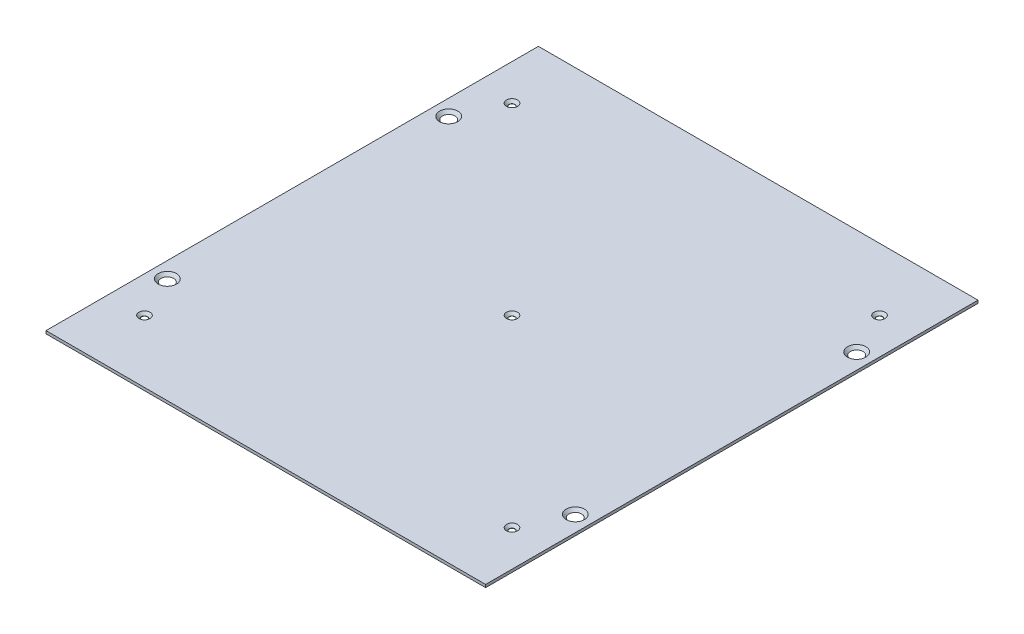
ISO-10303-21;
HEADER;
FILE_DESCRIPTION(('STEP AP214'),'2;1');
FILE_NAME('part.step','',(''),(''),'','','');
FILE_SCHEMA(('AUTOMOTIVE_DESIGN { 1 0 10303 214 1 1 1 1 }'));
ENDSEC;
DATA;
#1=APPLICATION_CONTEXT('core data for automotive mechanical design processes');
#2=APPLICATION_PROTOCOL_DEFINITION('international standard','automotive_design',2000,#1);
#3=PRODUCT_CONTEXT('',#1,'mechanical');
#4=PRODUCT('Part','Part','',(#3));
#5=PRODUCT_RELATED_PRODUCT_CATEGORY('part','',(#4));
#6=PRODUCT_DEFINITION_FORMATION('','',#4);
#7=PRODUCT_DEFINITION_CONTEXT('part definition',#1,'design');
#8=PRODUCT_DEFINITION('design','',#6,#7);
#9=PRODUCT_DEFINITION_SHAPE('','',#8);
#10=(LENGTH_UNIT() NAMED_UNIT(*) SI_UNIT(.MILLI.,.METRE.));
#11=(NAMED_UNIT(*) PLANE_ANGLE_UNIT() SI_UNIT($,.RADIAN.));
#12=(NAMED_UNIT(*) SI_UNIT($,.STERADIAN.) SOLID_ANGLE_UNIT());
#13=UNCERTAINTY_MEASURE_WITH_UNIT(LENGTH_MEASURE(1.E-05),#10,'distance_accuracy_value','');
#14=(GEOMETRIC_REPRESENTATION_CONTEXT(3) GLOBAL_UNCERTAINTY_ASSIGNED_CONTEXT((#13)) GLOBAL_UNIT_ASSIGNED_CONTEXT((#10,
#11,#12)) REPRESENTATION_CONTEXT('',''));
#15=CARTESIAN_POINT('',(0.,0.,0.));
#16=DIRECTION('',(0.,0.,1.));
#17=DIRECTION('',(1.,0.,0.));
#18=AXIS2_PLACEMENT_3D('',#15,#16,#17);
#19=CARTESIAN_POINT('',(125.,0.,140.));
#20=DIRECTION('',(0.,1.,0.));
#21=DIRECTION('',(0.,0.,1.));
#22=AXIS2_PLACEMENT_3D('',#19,#20,#21);
#23=PLANE('',#22);
#24=CARTESIAN_POINT('',(0.,0.,0.));
#25=DIRECTION('',(0.,1.,0.));
#26=DIRECTION('',(0.,0.,1.));
#27=AXIS2_PLACEMENT_3D('',#24,#25,#26);
#28=CIRCLE('',#27,1.7);
#29=CARTESIAN_POINT('',(0.,0.,1.7));
#30=VERTEX_POINT('',#29);
#31=EDGE_CURVE('E367',#30,#30,#28,.T.);
#32=ORIENTED_EDGE('',*,*,#31,.T.);
#33=EDGE_LOOP('',(#32));
#34=FACE_BOUND('',#33,.T.);
#35=CARTESIAN_POINT('',(-104.5,0.,104.5));
#36=DIRECTION('',(0.,1.,0.));
#37=DIRECTION('',(0.,0.,1.));
#38=AXIS2_PLACEMENT_3D('',#35,#36,#37);
#39=CIRCLE('',#38,1.69999999999999);
#40=CARTESIAN_POINT('',(-104.5,0.,106.2));
#41=VERTEX_POINT('',#40);
#42=EDGE_CURVE('E378',#41,#41,#39,.T.);
#43=ORIENTED_EDGE('',*,*,#42,.T.);
#44=EDGE_LOOP('',(#43));
#45=FACE_BOUND('',#44,.T.);
#46=CARTESIAN_POINT('',(104.5,0.,104.5));
#47=DIRECTION('',(0.,1.,0.));
#48=DIRECTION('',(0.,0.,1.));
#49=AXIS2_PLACEMENT_3D('',#46,#47,#48);
#50=CIRCLE('',#49,1.69999999999999);
#51=CARTESIAN_POINT('',(104.5,0.,106.2));
#52=VERTEX_POINT('',#51);
#53=EDGE_CURVE('E183',#52,#52,#50,.T.);
#54=ORIENTED_EDGE('',*,*,#53,.T.);
#55=EDGE_LOOP('',(#54));
#56=FACE_BOUND('',#55,.T.);
#57=CARTESIAN_POINT('',(104.5,0.,-104.5));
#58=DIRECTION('',(0.,1.,0.));
#59=DIRECTION('',(0.,0.,1.));
#60=AXIS2_PLACEMENT_3D('',#57,#58,#59);
#61=CIRCLE('',#60,1.69999999999999);
#62=CARTESIAN_POINT('',(104.5,0.,-102.8));
#63=VERTEX_POINT('',#62);
#64=EDGE_CURVE('E171',#63,#63,#61,.T.);
#65=ORIENTED_EDGE('',*,*,#64,.T.);
#66=EDGE_LOOP('',(#65));
#67=FACE_BOUND('',#66,.T.);
#68=CARTESIAN_POINT('',(-104.5,0.,-104.5));
#69=DIRECTION('',(0.,1.,0.));
#70=DIRECTION('',(0.,0.,1.));
#71=AXIS2_PLACEMENT_3D('',#68,#69,#70);
#72=CIRCLE('',#71,1.69999999999999);
#73=CARTESIAN_POINT('',(-104.5,0.,-102.8));
#74=VERTEX_POINT('',#73);
#75=EDGE_CURVE('E160',#74,#74,#72,.T.);
#76=ORIENTED_EDGE('',*,*,#75,.T.);
#77=EDGE_LOOP('',(#76));
#78=FACE_BOUND('',#77,.T.);
#79=CARTESIAN_POINT('',(-116.,0.,-80.));
#80=DIRECTION('',(0.,1.,0.));
#81=DIRECTION('',(0.,0.,1.));
#82=AXIS2_PLACEMENT_3D('',#79,#80,#81);
#83=CIRCLE('',#82,3.6);
#84=CARTESIAN_POINT('',(-116.,0.,-76.4));
#85=VERTEX_POINT('',#84);
#86=EDGE_CURVE('E153',#85,#85,#83,.T.);
#87=ORIENTED_EDGE('',*,*,#86,.T.);
#88=EDGE_LOOP('',(#87));
#89=FACE_BOUND('',#88,.T.);
#90=CARTESIAN_POINT('',(116.,0.,-80.));
#91=DIRECTION('',(0.,1.,0.));
#92=DIRECTION('',(0.,0.,1.));
#93=AXIS2_PLACEMENT_3D('',#90,#91,#92);
#94=CIRCLE('',#93,3.6);
#95=CARTESIAN_POINT('',(116.,0.,-76.3999999999999));
#96=VERTEX_POINT('',#95);
#97=EDGE_CURVE('E142',#96,#96,#94,.T.);
#98=ORIENTED_EDGE('',*,*,#97,.T.);
#99=EDGE_LOOP('',(#98));
#100=FACE_BOUND('',#99,.T.);
#101=CARTESIAN_POINT('',(116.,0.,80.));
#102=DIRECTION('',(0.,1.,0.));
#103=DIRECTION('',(0.,0.,1.));
#104=AXIS2_PLACEMENT_3D('',#101,#102,#103);
#105=CIRCLE('',#104,3.6);
#106=CARTESIAN_POINT('',(116.,0.,83.6));
#107=VERTEX_POINT('',#106);
#108=EDGE_CURVE('E134',#107,#107,#105,.T.);
#109=ORIENTED_EDGE('',*,*,#108,.T.);
#110=EDGE_LOOP('',(#109));
#111=FACE_BOUND('',#110,.T.);
#112=DIRECTION('',(0.,0.,-1.));
#113=VECTOR('',#112,1.);
#114=CARTESIAN_POINT('',(125.,0.,-140.));
#115=LINE('',#114,#113);
#116=CARTESIAN_POINT('',(125.,0.,140.));
#117=VERTEX_POINT('',#116);
#118=CARTESIAN_POINT('',(125.,0.,-140.));
#119=VERTEX_POINT('',#118);
#120=EDGE_CURVE('E103',#117,#119,#115,.T.);
#121=ORIENTED_EDGE('',*,*,#120,.F.);
#122=DIRECTION('',(1.,0.,0.));
#123=VECTOR('',#122,1.);
#124=CARTESIAN_POINT('',(-125.,0.,140.));
#125=LINE('',#124,#123);
#126=CARTESIAN_POINT('',(-125.,0.,140.));
#127=VERTEX_POINT('',#126);
#128=EDGE_CURVE('E79',#127,#117,#125,.T.);
#129=ORIENTED_EDGE('',*,*,#128,.F.);
#130=DIRECTION('',(0.,0.,1.));
#131=VECTOR('',#130,1.);
#132=CARTESIAN_POINT('',(-125.,0.,-140.));
#133=LINE('',#132,#131);
#134=CARTESIAN_POINT('',(-125.,0.,-140.));
#135=VERTEX_POINT('',#134);
#136=EDGE_CURVE('E73',#135,#127,#133,.T.);
#137=ORIENTED_EDGE('',*,*,#136,.F.);
#138=DIRECTION('',(-1.,0.,0.));
#139=VECTOR('',#138,1.);
#140=CARTESIAN_POINT('',(-125.,0.,-140.));
#141=LINE('',#140,#139);
#142=EDGE_CURVE('E95',#119,#135,#141,.T.);
#143=ORIENTED_EDGE('',*,*,#142,.F.);
#144=EDGE_LOOP('',(#121,#129,#137,#143));
#145=FACE_BOUND('',#144,.T.);
#146=CARTESIAN_POINT('',(-116.,0.,80.));
#147=DIRECTION('',(0.,1.,0.));
#148=DIRECTION('',(0.,0.,1.));
#149=AXIS2_PLACEMENT_3D('',#146,#147,#148);
#150=CIRCLE('',#149,3.6);
#151=CARTESIAN_POINT('',(-116.,0.,83.6));
#152=VERTEX_POINT('',#151);
#153=EDGE_CURVE('E108',#152,#152,#150,.T.);
#154=ORIENTED_EDGE('',*,*,#153,.T.);
#155=EDGE_LOOP('',(#154));
#156=FACE_BOUND('',#155,.T.);
#157=ADVANCED_FACE('F39',(#34,#45,#56,#67,#78,#89,#100,#111,#145,#156),#23,.F.);
#158=CARTESIAN_POINT('',(125.,1.6,-140.));
#159=DIRECTION('',(-1.,0.,0.));
#160=DIRECTION('',(0.,0.,1.));
#161=AXIS2_PLACEMENT_3D('',#158,#159,#160);
#162=PLANE('',#161);
#163=ORIENTED_EDGE('',*,*,#120,.T.);
#164=DIRECTION('',(0.,-1.,0.));
#165=VECTOR('',#164,1.);
#166=CARTESIAN_POINT('',(125.,1.6,-140.));
#167=LINE('',#166,#165);
#168=CARTESIAN_POINT('',(125.,1.6,-140.));
#169=VERTEX_POINT('',#168);
#170=EDGE_CURVE('E12',#169,#119,#167,.T.);
#171=ORIENTED_EDGE('',*,*,#170,.F.);
#172=DIRECTION('',(0.,0.,-1.));
#173=VECTOR('',#172,1.);
#174=CARTESIAN_POINT('',(125.,1.6,-140.));
#175=LINE('',#174,#173);
#176=CARTESIAN_POINT('',(125.,1.6,140.));
#177=VERTEX_POINT('',#176);
#178=EDGE_CURVE('E91',#177,#169,#175,.T.);
#179=ORIENTED_EDGE('',*,*,#178,.F.);
#180=DIRECTION('',(0.,-1.,0.));
#181=VECTOR('',#180,1.);
#182=CARTESIAN_POINT('',(125.,1.6,140.));
#183=LINE('',#182,#181);
#184=EDGE_CURVE('E99',#177,#117,#183,.T.);
#185=ORIENTED_EDGE('',*,*,#184,.T.);
#186=EDGE_LOOP('',(#163,#171,#179,#185));
#187=FACE_BOUND('',#186,.T.);
#188=ADVANCED_FACE('F41',(#187),#162,.F.);
#189=CARTESIAN_POINT('',(-125.,1.6,-140.));
#190=DIRECTION('',(0.,0.,1.));
#191=DIRECTION('',(1.,0.,0.));
#192=AXIS2_PLACEMENT_3D('',#189,#190,#191);
#193=PLANE('',#192);
#194=ORIENTED_EDGE('',*,*,#142,.T.);
#195=DIRECTION('',(0.,-1.,0.));
#196=VECTOR('',#195,1.);
#197=CARTESIAN_POINT('',(-125.,1.6,-140.));
#198=LINE('',#197,#196);
#199=CARTESIAN_POINT('',(-125.,1.6,-140.));
#200=VERTEX_POINT('',#199);
#201=EDGE_CURVE('E48',#200,#135,#198,.T.);
#202=ORIENTED_EDGE('',*,*,#201,.F.);
#203=DIRECTION('',(-1.,0.,0.));
#204=VECTOR('',#203,1.);
#205=CARTESIAN_POINT('',(-125.,1.6,-140.));
#206=LINE('',#205,#204);
#207=EDGE_CURVE('E86',#169,#200,#206,.T.);
#208=ORIENTED_EDGE('',*,*,#207,.F.);
#209=ORIENTED_EDGE('',*,*,#170,.T.);
#210=EDGE_LOOP('',(#194,#202,#208,#209));
#211=FACE_BOUND('',#210,.T.);
#212=ADVANCED_FACE('F94',(#211),#193,.F.);
#213=CARTESIAN_POINT('',(-125.,1.6,-140.));
#214=DIRECTION('',(1.,0.,0.));
#215=DIRECTION('',(0.,0.,-1.));
#216=AXIS2_PLACEMENT_3D('',#213,#214,#215);
#217=PLANE('',#216);
#218=ORIENTED_EDGE('',*,*,#136,.T.);
#219=DIRECTION('',(0.,-1.,0.));
#220=VECTOR('',#219,1.);
#221=CARTESIAN_POINT('',(-125.,1.6,140.));
#222=LINE('',#221,#220);
#223=CARTESIAN_POINT('',(-125.,1.6,140.));
#224=VERTEX_POINT('',#223);
#225=EDGE_CURVE('E96',#224,#127,#222,.T.);
#226=ORIENTED_EDGE('',*,*,#225,.F.);
#227=DIRECTION('',(0.,0.,1.));
#228=VECTOR('',#227,1.);
#229=CARTESIAN_POINT('',(-125.,1.6,-140.));
#230=LINE('',#229,#228);
#231=EDGE_CURVE('E89',#200,#224,#230,.T.);
#232=ORIENTED_EDGE('',*,*,#231,.F.);
#233=ORIENTED_EDGE('',*,*,#201,.T.);
#234=EDGE_LOOP('',(#218,#226,#232,#233));
#235=FACE_BOUND('',#234,.T.);
#236=ADVANCED_FACE('F97',(#235),#217,.F.);
#237=CARTESIAN_POINT('',(-125.,1.6,140.));
#238=DIRECTION('',(0.,0.,-1.));
#239=DIRECTION('',(-1.,0.,0.));
#240=AXIS2_PLACEMENT_3D('',#237,#238,#239);
#241=PLANE('',#240);
#242=ORIENTED_EDGE('',*,*,#128,.T.);
#243=ORIENTED_EDGE('',*,*,#184,.F.);
#244=DIRECTION('',(1.,0.,0.));
#245=VECTOR('',#244,1.);
#246=CARTESIAN_POINT('',(-125.,1.6,140.));
#247=LINE('',#246,#245);
#248=EDGE_CURVE('E56',#224,#177,#247,.T.);
#249=ORIENTED_EDGE('',*,*,#248,.F.);
#250=ORIENTED_EDGE('',*,*,#225,.T.);
#251=EDGE_LOOP('',(#242,#243,#249,#250));
#252=FACE_BOUND('',#251,.T.);
#253=ADVANCED_FACE('F123',(#252),#241,.F.);
#254=CARTESIAN_POINT('',(125.,1.6,140.));
#255=DIRECTION('',(0.,1.,0.));
#256=DIRECTION('',(0.,0.,1.));
#257=AXIS2_PLACEMENT_3D('',#254,#255,#256);
#258=PLANE('',#257);
#259=CARTESIAN_POINT('',(0.,1.6,0.));
#260=DIRECTION('',(0.,1.,0.));
#261=DIRECTION('',(0.,0.,1.));
#262=AXIS2_PLACEMENT_3D('',#259,#260,#261);
#263=CIRCLE('',#262,3.15);
#264=CARTESIAN_POINT('',(0.,1.6,3.15));
#265=VERTEX_POINT('',#264);
#266=EDGE_CURVE('E365',#265,#265,#263,.T.);
#267=ORIENTED_EDGE('',*,*,#266,.F.);
#268=EDGE_LOOP('',(#267));
#269=FACE_BOUND('',#268,.T.);
#270=CARTESIAN_POINT('',(-104.5,1.6,104.5));
#271=DIRECTION('',(0.,1.,0.));
#272=DIRECTION('',(0.,0.,1.));
#273=AXIS2_PLACEMENT_3D('',#270,#271,#272);
#274=CIRCLE('',#273,3.15);
#275=CARTESIAN_POINT('',(-104.5,1.6,107.65));
#276=VERTEX_POINT('',#275);
#277=EDGE_CURVE('E373',#276,#276,#274,.T.);
#278=ORIENTED_EDGE('',*,*,#277,.F.);
#279=EDGE_LOOP('',(#278));
#280=FACE_BOUND('',#279,.T.);
#281=CARTESIAN_POINT('',(104.5,1.6,104.5));
#282=DIRECTION('',(0.,1.,0.));
#283=DIRECTION('',(0.,0.,1.));
#284=AXIS2_PLACEMENT_3D('',#281,#282,#283);
#285=CIRCLE('',#284,3.15);
#286=CARTESIAN_POINT('',(104.5,1.6,107.65));
#287=VERTEX_POINT('',#286);
#288=EDGE_CURVE('E382',#287,#287,#285,.T.);
#289=ORIENTED_EDGE('',*,*,#288,.F.);
#290=EDGE_LOOP('',(#289));
#291=FACE_BOUND('',#290,.T.);
#292=CARTESIAN_POINT('',(104.5,1.6,-104.5));
#293=DIRECTION('',(0.,1.,0.));
#294=DIRECTION('',(0.,0.,1.));
#295=AXIS2_PLACEMENT_3D('',#292,#293,#294);
#296=CIRCLE('',#295,3.15);
#297=CARTESIAN_POINT('',(104.5,1.6,-101.35));
#298=VERTEX_POINT('',#297);
#299=EDGE_CURVE('E188',#298,#298,#296,.T.);
#300=ORIENTED_EDGE('',*,*,#299,.F.);
#301=EDGE_LOOP('',(#300));
#302=FACE_BOUND('',#301,.T.);
#303=CARTESIAN_POINT('',(-104.5,1.6,-104.5));
#304=DIRECTION('',(0.,1.,0.));
#305=DIRECTION('',(0.,0.,1.));
#306=AXIS2_PLACEMENT_3D('',#303,#304,#305);
#307=CIRCLE('',#306,3.15);
#308=CARTESIAN_POINT('',(-104.5,1.6,-101.35));
#309=VERTEX_POINT('',#308);
#310=EDGE_CURVE('E168',#309,#309,#307,.T.);
#311=ORIENTED_EDGE('',*,*,#310,.F.);
#312=EDGE_LOOP('',(#311));
#313=FACE_BOUND('',#312,.T.);
#314=CARTESIAN_POINT('',(-116.,1.6,-80.));
#315=DIRECTION('',(0.,1.,0.));
#316=DIRECTION('',(0.,0.,1.));
#317=AXIS2_PLACEMENT_3D('',#314,#315,#316);
#318=CIRCLE('',#317,5.2);
#319=CARTESIAN_POINT('',(-116.,1.6,-74.8));
#320=VERTEX_POINT('',#319);
#321=EDGE_CURVE('E158',#320,#320,#318,.T.);
#322=ORIENTED_EDGE('',*,*,#321,.F.);
#323=EDGE_LOOP('',(#322));
#324=FACE_BOUND('',#323,.T.);
#325=CARTESIAN_POINT('',(116.,1.6,-80.));
#326=DIRECTION('',(0.,1.,0.));
#327=DIRECTION('',(0.,0.,1.));
#328=AXIS2_PLACEMENT_3D('',#325,#326,#327);
#329=CIRCLE('',#328,5.2);
#330=CARTESIAN_POINT('',(116.,1.6,-74.8));
#331=VERTEX_POINT('',#330);
#332=EDGE_CURVE('E147',#331,#331,#329,.T.);
#333=ORIENTED_EDGE('',*,*,#332,.F.);
#334=EDGE_LOOP('',(#333));
#335=FACE_BOUND('',#334,.T.);
#336=CARTESIAN_POINT('',(116.,1.6,80.));
#337=DIRECTION('',(0.,1.,0.));
#338=DIRECTION('',(0.,0.,1.));
#339=AXIS2_PLACEMENT_3D('',#336,#337,#338);
#340=CIRCLE('',#339,5.2);
#341=CARTESIAN_POINT('',(116.,1.6,85.2));
#342=VERTEX_POINT('',#341);
#343=EDGE_CURVE('E139',#342,#342,#340,.T.);
#344=ORIENTED_EDGE('',*,*,#343,.F.);
#345=EDGE_LOOP('',(#344));
#346=FACE_BOUND('',#345,.T.);
#347=CARTESIAN_POINT('',(-116.,1.6,80.));
#348=DIRECTION('',(0.,1.,0.));
#349=DIRECTION('',(0.,0.,1.));
#350=AXIS2_PLACEMENT_3D('',#347,#348,#349);
#351=CIRCLE('',#350,5.2);
#352=CARTESIAN_POINT('',(-116.,1.6,85.2));
#353=VERTEX_POINT('',#352);
#354=EDGE_CURVE('E132',#353,#353,#351,.T.);
#355=ORIENTED_EDGE('',*,*,#354,.F.);
#356=EDGE_LOOP('',(#355));
#357=FACE_BOUND('',#356,.T.);
#358=ORIENTED_EDGE('',*,*,#178,.T.);
#359=ORIENTED_EDGE('',*,*,#207,.T.);
#360=ORIENTED_EDGE('',*,*,#231,.T.);
#361=ORIENTED_EDGE('',*,*,#248,.T.);
#362=EDGE_LOOP('',(#358,#359,#360,#361));
#363=FACE_BOUND('',#362,.T.);
#364=ADVANCED_FACE('F87',(#269,#280,#291,#302,#313,#324,#335,#346,#357,#363),#258,.T.);
#365=CARTESIAN_POINT('',(-116.,1.6,80.));
#366=DIRECTION('',(0.,1.,0.));
#367=DIRECTION('',(0.,0.,1.));
#368=AXIS2_PLACEMENT_3D('',#365,#366,#367);
#369=CONICAL_SURFACE('',#368,5.2,0.785398163397447);
#370=ORIENTED_EDGE('',*,*,#354,.T.);
#371=EDGE_LOOP('',(#370));
#372=FACE_BOUND('',#371,.T.);
#373=ORIENTED_EDGE('',*,*,#153,.F.);
#374=EDGE_LOOP('',(#373));
#375=FACE_BOUND('',#374,.T.);
#376=ADVANCED_FACE('F247',(#372,#375),#369,.F.);
#377=CARTESIAN_POINT('',(116.,1.6,80.));
#378=DIRECTION('',(0.,1.,0.));
#379=DIRECTION('',(0.,0.,1.));
#380=AXIS2_PLACEMENT_3D('',#377,#378,#379);
#381=CONICAL_SURFACE('',#380,5.2,0.785398163397447);
#382=ORIENTED_EDGE('',*,*,#343,.T.);
#383=EDGE_LOOP('',(#382));
#384=FACE_BOUND('',#383,.T.);
#385=ORIENTED_EDGE('',*,*,#108,.F.);
#386=EDGE_LOOP('',(#385));
#387=FACE_BOUND('',#386,.T.);
#388=ADVANCED_FACE('F254',(#384,#387),#381,.F.);
#389=CARTESIAN_POINT('',(116.,1.6,-80.));
#390=DIRECTION('',(0.,1.,0.));
#391=DIRECTION('',(0.,0.,1.));
#392=AXIS2_PLACEMENT_3D('',#389,#390,#391);
#393=CONICAL_SURFACE('',#392,5.2,0.785398163397447);
#394=ORIENTED_EDGE('',*,*,#332,.T.);
#395=EDGE_LOOP('',(#394));
#396=FACE_BOUND('',#395,.T.);
#397=ORIENTED_EDGE('',*,*,#97,.F.);
#398=EDGE_LOOP('',(#397));
#399=FACE_BOUND('',#398,.T.);
#400=ADVANCED_FACE('F261',(#396,#399),#393,.F.);
#401=CARTESIAN_POINT('',(-116.,1.6,-80.));
#402=DIRECTION('',(0.,1.,0.));
#403=DIRECTION('',(0.,0.,1.));
#404=AXIS2_PLACEMENT_3D('',#401,#402,#403);
#405=CONICAL_SURFACE('',#404,5.2,0.785398163397447);
#406=ORIENTED_EDGE('',*,*,#321,.T.);
#407=EDGE_LOOP('',(#406));
#408=FACE_BOUND('',#407,.T.);
#409=ORIENTED_EDGE('',*,*,#86,.F.);
#410=EDGE_LOOP('',(#409));
#411=FACE_BOUND('',#410,.T.);
#412=ADVANCED_FACE('F269',(#408,#411),#405,.F.);
#413=CARTESIAN_POINT('',(-104.5,1.6,-104.5));
#414=DIRECTION('',(0.,1.,0.));
#415=DIRECTION('',(0.,0.,1.));
#416=AXIS2_PLACEMENT_3D('',#413,#414,#415);
#417=CYLINDRICAL_SURFACE('',#416,1.69999999999999);
#418=ORIENTED_EDGE('',*,*,#75,.F.);
#419=EDGE_LOOP('',(#418));
#420=FACE_BOUND('',#419,.T.);
#421=CARTESIAN_POINT('',(-104.5,0.15,-104.5));
#422=DIRECTION('',(0.,1.,0.));
#423=DIRECTION('',(0.,0.,1.));
#424=AXIS2_PLACEMENT_3D('',#421,#422,#423);
#425=CIRCLE('',#424,1.69999999999999);
#426=CARTESIAN_POINT('',(-104.5,0.15,-102.8));
#427=VERTEX_POINT('',#426);
#428=EDGE_CURVE('E165',#427,#427,#425,.T.);
#429=ORIENTED_EDGE('',*,*,#428,.T.);
#430=EDGE_LOOP('',(#429));
#431=FACE_BOUND('',#430,.T.);
#432=ADVANCED_FACE('F277',(#420,#431),#417,.F.);
#433=CARTESIAN_POINT('',(-104.5,1.6,-104.5));
#434=DIRECTION('',(0.,1.,0.));
#435=DIRECTION('',(0.,0.,1.));
#436=AXIS2_PLACEMENT_3D('',#433,#434,#435);
#437=CONICAL_SURFACE('',#436,3.15,0.78539816339745);
#438=ORIENTED_EDGE('',*,*,#428,.F.);
#439=EDGE_LOOP('',(#438));
#440=FACE_BOUND('',#439,.T.);
#441=ORIENTED_EDGE('',*,*,#310,.T.);
#442=EDGE_LOOP('',(#441));
#443=FACE_BOUND('',#442,.T.);
#444=ADVANCED_FACE('F210',(#440,#443),#437,.F.);
#445=CARTESIAN_POINT('',(104.5,1.6,-104.5));
#446=DIRECTION('',(0.,1.,0.));
#447=DIRECTION('',(0.,0.,1.));
#448=AXIS2_PLACEMENT_3D('',#445,#446,#447);
#449=CYLINDRICAL_SURFACE('',#448,1.69999999999999);
#450=ORIENTED_EDGE('',*,*,#64,.F.);
#451=EDGE_LOOP('',(#450));
#452=FACE_BOUND('',#451,.T.);
#453=CARTESIAN_POINT('',(104.5,0.15,-104.5));
#454=DIRECTION('',(0.,1.,0.));
#455=DIRECTION('',(0.,0.,1.));
#456=AXIS2_PLACEMENT_3D('',#453,#454,#455);
#457=CIRCLE('',#456,1.69999999999999);
#458=CARTESIAN_POINT('',(104.5,0.15,-102.8));
#459=VERTEX_POINT('',#458);
#460=EDGE_CURVE('E176',#459,#459,#457,.T.);
#461=ORIENTED_EDGE('',*,*,#460,.T.);
#462=EDGE_LOOP('',(#461));
#463=FACE_BOUND('',#462,.T.);
#464=ADVANCED_FACE('F197',(#452,#463),#449,.F.);
#465=CARTESIAN_POINT('',(104.5,1.6,-104.5));
#466=DIRECTION('',(0.,1.,0.));
#467=DIRECTION('',(0.,0.,1.));
#468=AXIS2_PLACEMENT_3D('',#465,#466,#467);
#469=CONICAL_SURFACE('',#468,3.15,0.78539816339745);
#470=ORIENTED_EDGE('',*,*,#460,.F.);
#471=EDGE_LOOP('',(#470));
#472=FACE_BOUND('',#471,.T.);
#473=ORIENTED_EDGE('',*,*,#299,.T.);
#474=EDGE_LOOP('',(#473));
#475=FACE_BOUND('',#474,.T.);
#476=ADVANCED_FACE('F199',(#472,#475),#469,.F.);
#477=CARTESIAN_POINT('',(104.5,1.6,104.5));
#478=DIRECTION('',(0.,1.,0.));
#479=DIRECTION('',(0.,0.,1.));
#480=AXIS2_PLACEMENT_3D('',#477,#478,#479);
#481=CYLINDRICAL_SURFACE('',#480,1.69999999999999);
#482=ORIENTED_EDGE('',*,*,#53,.F.);
#483=EDGE_LOOP('',(#482));
#484=FACE_BOUND('',#483,.T.);
#485=CARTESIAN_POINT('',(104.5,0.15,104.5));
#486=DIRECTION('',(0.,1.,0.));
#487=DIRECTION('',(0.,0.,1.));
#488=AXIS2_PLACEMENT_3D('',#485,#486,#487);
#489=CIRCLE('',#488,1.69999999999999);
#490=CARTESIAN_POINT('',(104.5,0.15,106.2));
#491=VERTEX_POINT('',#490);
#492=EDGE_CURVE('E189',#491,#491,#489,.T.);
#493=ORIENTED_EDGE('',*,*,#492,.T.);
#494=EDGE_LOOP('',(#493));
#495=FACE_BOUND('',#494,.T.);
#496=ADVANCED_FACE('F201',(#484,#495),#481,.F.);
#497=CARTESIAN_POINT('',(104.5,1.6,104.5));
#498=DIRECTION('',(0.,1.,0.));
#499=DIRECTION('',(0.,0.,1.));
#500=AXIS2_PLACEMENT_3D('',#497,#498,#499);
#501=CONICAL_SURFACE('',#500,3.15,0.78539816339745);
#502=ORIENTED_EDGE('',*,*,#492,.F.);
#503=EDGE_LOOP('',(#502));
#504=FACE_BOUND('',#503,.T.);
#505=ORIENTED_EDGE('',*,*,#288,.T.);
#506=EDGE_LOOP('',(#505));
#507=FACE_BOUND('',#506,.T.);
#508=ADVANCED_FACE('F207',(#504,#507),#501,.F.);
#509=CARTESIAN_POINT('',(-104.5,1.6,104.5));
#510=DIRECTION('',(0.,1.,0.));
#511=DIRECTION('',(0.,0.,1.));
#512=AXIS2_PLACEMENT_3D('',#509,#510,#511);
#513=CYLINDRICAL_SURFACE('',#512,1.69999999999999);
#514=ORIENTED_EDGE('',*,*,#42,.F.);
#515=EDGE_LOOP('',(#514));
#516=FACE_BOUND('',#515,.T.);
#517=CARTESIAN_POINT('',(-104.5,0.15,104.5));
#518=DIRECTION('',(0.,1.,0.));
#519=DIRECTION('',(0.,0.,1.));
#520=AXIS2_PLACEMENT_3D('',#517,#518,#519);
#521=CIRCLE('',#520,1.69999999999999);
#522=CARTESIAN_POINT('',(-104.5,0.15,106.2));
#523=VERTEX_POINT('',#522);
#524=EDGE_CURVE('E376',#523,#523,#521,.T.);
#525=ORIENTED_EDGE('',*,*,#524,.T.);
#526=EDGE_LOOP('',(#525));
#527=FACE_BOUND('',#526,.T.);
#528=ADVANCED_FACE('F315',(#516,#527),#513,.F.);
#529=CARTESIAN_POINT('',(-104.5,1.6,104.5));
#530=DIRECTION('',(0.,1.,0.));
#531=DIRECTION('',(0.,0.,1.));
#532=AXIS2_PLACEMENT_3D('',#529,#530,#531);
#533=CONICAL_SURFACE('',#532,3.15,0.78539816339745);
#534=ORIENTED_EDGE('',*,*,#524,.F.);
#535=EDGE_LOOP('',(#534));
#536=FACE_BOUND('',#535,.T.);
#537=ORIENTED_EDGE('',*,*,#277,.T.);
#538=EDGE_LOOP('',(#537));
#539=FACE_BOUND('',#538,.T.);
#540=ADVANCED_FACE('F325',(#536,#539),#533,.F.);
#541=CARTESIAN_POINT('',(0.,1.6,0.));
#542=DIRECTION('',(0.,1.,0.));
#543=DIRECTION('',(0.,0.,1.));
#544=AXIS2_PLACEMENT_3D('',#541,#542,#543);
#545=CYLINDRICAL_SURFACE('',#544,1.7);
#546=ORIENTED_EDGE('',*,*,#31,.F.);
#547=EDGE_LOOP('',(#546));
#548=FACE_BOUND('',#547,.T.);
#549=CARTESIAN_POINT('',(0.,0.15,0.));
#550=DIRECTION('',(0.,1.,0.));
#551=DIRECTION('',(0.,0.,1.));
#552=AXIS2_PLACEMENT_3D('',#549,#550,#551);
#553=CIRCLE('',#552,1.7);
#554=CARTESIAN_POINT('',(0.,0.15,1.7));
#555=VERTEX_POINT('',#554);
#556=EDGE_CURVE('E362',#555,#555,#553,.T.);
#557=ORIENTED_EDGE('',*,*,#556,.T.);
#558=EDGE_LOOP('',(#557));
#559=FACE_BOUND('',#558,.T.);
#560=ADVANCED_FACE('F335',(#548,#559),#545,.F.);
#561=CARTESIAN_POINT('',(0.,1.6,0.));
#562=DIRECTION('',(0.,1.,0.));
#563=DIRECTION('',(0.,0.,1.));
#564=AXIS2_PLACEMENT_3D('',#561,#562,#563);
#565=CONICAL_SURFACE('',#564,3.15,0.785398163397448);
#566=ORIENTED_EDGE('',*,*,#556,.F.);
#567=EDGE_LOOP('',(#566));
#568=FACE_BOUND('',#567,.T.);
#569=ORIENTED_EDGE('',*,*,#266,.T.);
#570=EDGE_LOOP('',(#569));
#571=FACE_BOUND('',#570,.T.);
#572=ADVANCED_FACE('F345',(#568,#571),#565,.F.);
#573=CLOSED_SHELL('',(#157,#188,#212,#236,#253,#364,#376,#388,#400,#412,#432,#444,#464,#476,
#496,#508,#528,#540,#560,#572));
#574=MANIFOLD_SOLID_BREP('B2',#573);
#575=ADVANCED_BREP_SHAPE_REPRESENTATION('',(#18,#574),#14);
#576=SHAPE_DEFINITION_REPRESENTATION(#9,#575);
ENDSEC;
END-ISO-10303-21;
